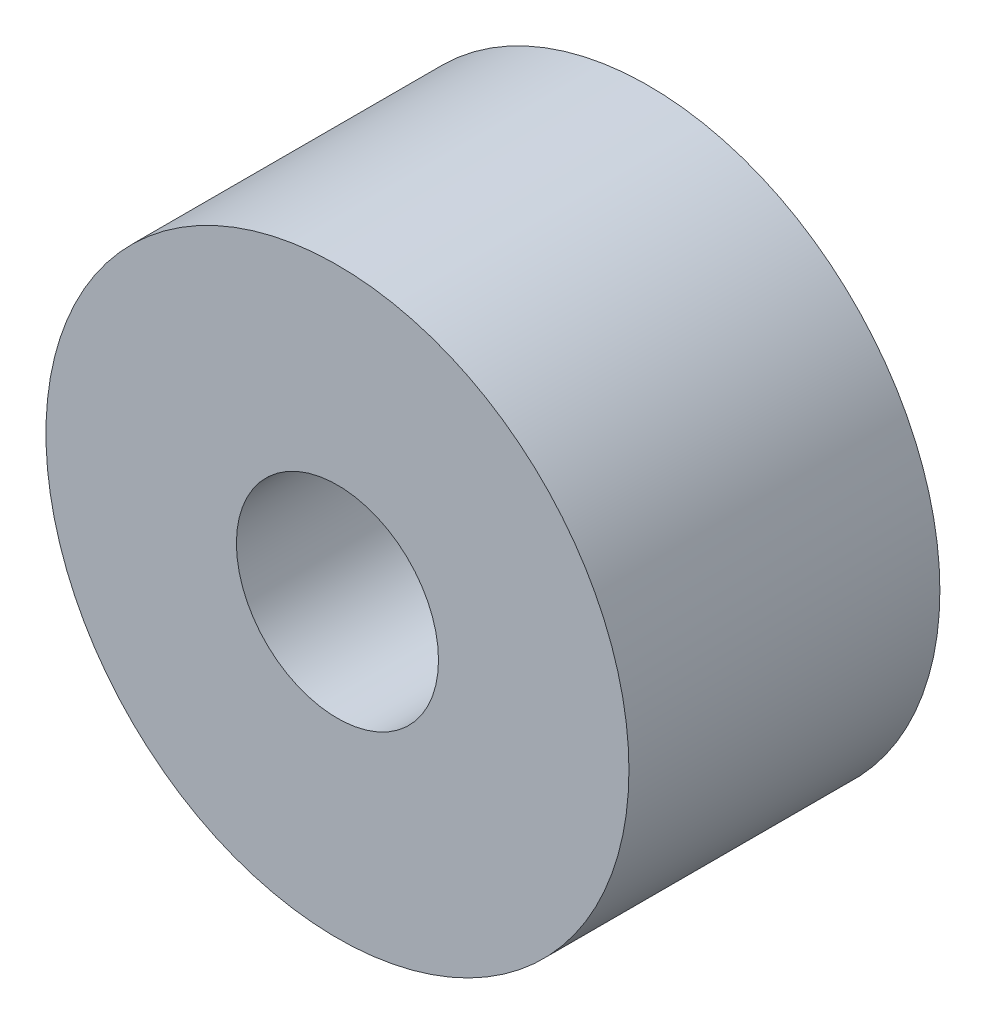
ISO-10303-21;
HEADER;
FILE_DESCRIPTION(('STEP AP214'),'2;1');
FILE_NAME('part.step','',(''),(''),'','','');
FILE_SCHEMA(('AUTOMOTIVE_DESIGN { 1 0 10303 214 1 1 1 1 }'));
ENDSEC;
DATA;
#1=APPLICATION_CONTEXT('core data for automotive mechanical design processes');
#2=APPLICATION_PROTOCOL_DEFINITION('international standard','automotive_design',2000,#1);
#3=PRODUCT_CONTEXT('',#1,'mechanical');
#4=PRODUCT('Part','Part','',(#3));
#5=PRODUCT_RELATED_PRODUCT_CATEGORY('part','',(#4));
#6=PRODUCT_DEFINITION_FORMATION('','',#4);
#7=PRODUCT_DEFINITION_CONTEXT('part definition',#1,'design');
#8=PRODUCT_DEFINITION('design','',#6,#7);
#9=PRODUCT_DEFINITION_SHAPE('','',#8);
#10=(LENGTH_UNIT() NAMED_UNIT(*) SI_UNIT(.MILLI.,.METRE.));
#11=(NAMED_UNIT(*) PLANE_ANGLE_UNIT() SI_UNIT($,.RADIAN.));
#12=(NAMED_UNIT(*) SI_UNIT($,.STERADIAN.) SOLID_ANGLE_UNIT());
#13=UNCERTAINTY_MEASURE_WITH_UNIT(LENGTH_MEASURE(1.E-05),#10,'distance_accuracy_value','');
#14=(GEOMETRIC_REPRESENTATION_CONTEXT(3) GLOBAL_UNCERTAINTY_ASSIGNED_CONTEXT((#13)) GLOBAL_UNIT_ASSIGNED_CONTEXT((#10,
#11,#12)) REPRESENTATION_CONTEXT('',''));
#15=CARTESIAN_POINT('',(0.,0.,0.));
#16=DIRECTION('',(0.,0.,1.));
#17=DIRECTION('',(1.,0.,0.));
#18=AXIS2_PLACEMENT_3D('',#15,#16,#17);
#19=CARTESIAN_POINT('',(0.,0.,8.));
#20=DIRECTION('',(0.,0.,1.));
#21=DIRECTION('',(1.,0.,0.));
#22=AXIS2_PLACEMENT_3D('',#19,#20,#21);
#23=PLANE('',#22);
#24=CARTESIAN_POINT('',(0.,0.,8.));
#25=DIRECTION('',(0.,0.,1.));
#26=DIRECTION('',(1.,0.,0.));
#27=AXIS2_PLACEMENT_3D('',#24,#25,#26);
#28=CIRCLE('',#27,7.5);
#29=CARTESIAN_POINT('',(7.5,0.,8.));
#30=VERTEX_POINT('',#29);
#31=EDGE_CURVE('E10',#30,#30,#28,.T.);
#32=ORIENTED_EDGE('',*,*,#31,.T.);
#33=EDGE_LOOP('',(#32));
#34=FACE_BOUND('',#33,.T.);
#35=CARTESIAN_POINT('',(0.,0.,8.));
#36=DIRECTION('',(0.,0.,1.));
#37=DIRECTION('',(1.,0.,0.));
#38=AXIS2_PLACEMENT_3D('',#35,#36,#37);
#39=CIRCLE('',#38,2.6);
#40=CARTESIAN_POINT('',(2.6,0.,8.));
#41=VERTEX_POINT('',#40);
#42=EDGE_CURVE('E42',#41,#41,#39,.T.);
#43=ORIENTED_EDGE('',*,*,#42,.F.);
#44=EDGE_LOOP('',(#43));
#45=FACE_BOUND('',#44,.T.);
#46=ADVANCED_FACE('F31',(#34,#45),#23,.T.);
#47=CARTESIAN_POINT('',(0.,0.,0.));
#48=DIRECTION('',(0.,0.,1.));
#49=DIRECTION('',(1.,0.,0.));
#50=AXIS2_PLACEMENT_3D('',#47,#48,#49);
#51=PLANE('',#50);
#52=CARTESIAN_POINT('',(0.,0.,0.));
#53=DIRECTION('',(0.,0.,1.));
#54=DIRECTION('',(1.,0.,0.));
#55=AXIS2_PLACEMENT_3D('',#52,#53,#54);
#56=CIRCLE('',#55,7.5);
#57=CARTESIAN_POINT('',(7.5,0.,0.));
#58=VERTEX_POINT('',#57);
#59=EDGE_CURVE('E35',#58,#58,#56,.T.);
#60=ORIENTED_EDGE('',*,*,#59,.F.);
#61=EDGE_LOOP('',(#60));
#62=FACE_BOUND('',#61,.T.);
#63=CARTESIAN_POINT('',(0.,0.,0.));
#64=DIRECTION('',(0.,0.,1.));
#65=DIRECTION('',(1.,0.,0.));
#66=AXIS2_PLACEMENT_3D('',#63,#64,#65);
#67=CIRCLE('',#66,2.6);
#68=CARTESIAN_POINT('',(2.6,0.,0.));
#69=VERTEX_POINT('',#68);
#70=EDGE_CURVE('E44',#69,#69,#67,.T.);
#71=ORIENTED_EDGE('',*,*,#70,.T.);
#72=EDGE_LOOP('',(#71));
#73=FACE_BOUND('',#72,.T.);
#74=ADVANCED_FACE('F54',(#62,#73),#51,.F.);
#75=CARTESIAN_POINT('',(0.,0.,8.));
#76=DIRECTION('',(0.,0.,-1.));
#77=DIRECTION('',(-1.,0.,0.));
#78=AXIS2_PLACEMENT_3D('',#75,#76,#77);
#79=CYLINDRICAL_SURFACE('',#78,7.5);
#80=ORIENTED_EDGE('',*,*,#31,.F.);
#81=EDGE_LOOP('',(#80));
#82=FACE_BOUND('',#81,.T.);
#83=ORIENTED_EDGE('',*,*,#59,.T.);
#84=EDGE_LOOP('',(#83));
#85=FACE_BOUND('',#84,.T.);
#86=ADVANCED_FACE('F33',(#82,#85),#79,.T.);
#87=CARTESIAN_POINT('',(0.,0.,8.));
#88=DIRECTION('',(0.,0.,-1.));
#89=DIRECTION('',(-1.,0.,0.));
#90=AXIS2_PLACEMENT_3D('',#87,#88,#89);
#91=CYLINDRICAL_SURFACE('',#90,2.6);
#92=ORIENTED_EDGE('',*,*,#42,.T.);
#93=EDGE_LOOP('',(#92));
#94=FACE_BOUND('',#93,.T.);
#95=ORIENTED_EDGE('',*,*,#70,.F.);
#96=EDGE_LOOP('',(#95));
#97=FACE_BOUND('',#96,.T.);
#98=ADVANCED_FACE('F50',(#94,#97),#91,.F.);
#99=CLOSED_SHELL('',(#46,#74,#86,#98));
#100=MANIFOLD_SOLID_BREP('B2',#99);
#101=ADVANCED_BREP_SHAPE_REPRESENTATION('',(#18,#100),#14);
#102=SHAPE_DEFINITION_REPRESENTATION(#9,#101);
ENDSEC;
END-ISO-10303-21;
